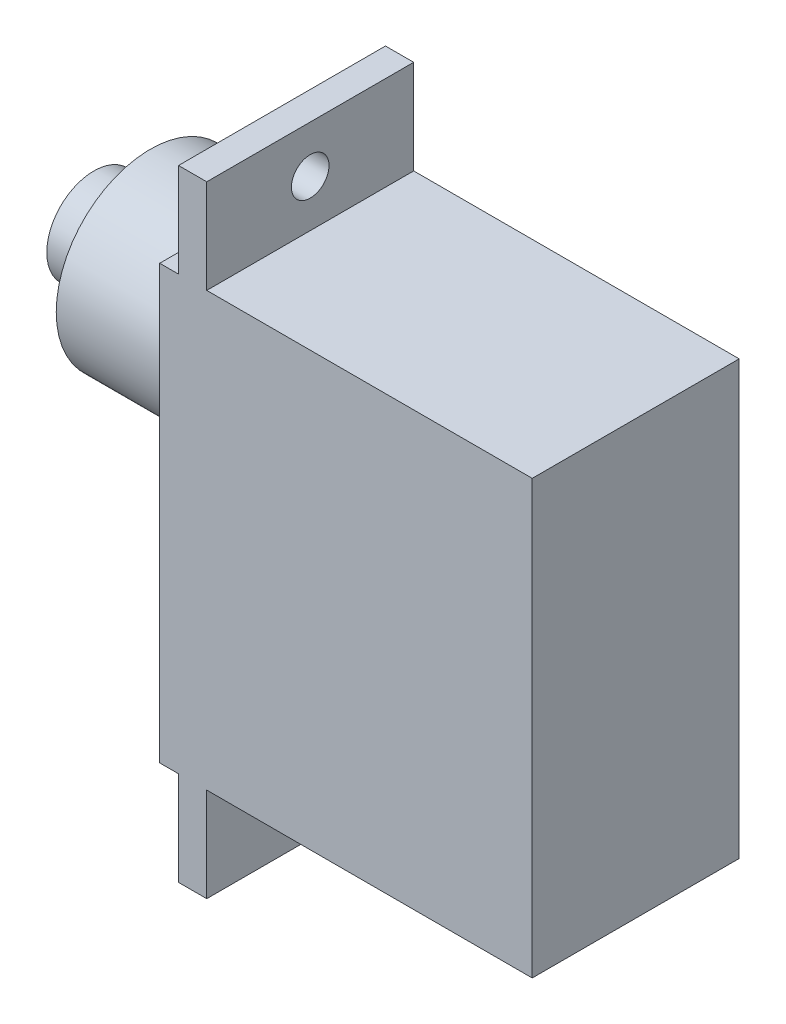
ISO-10303-21;
HEADER;
FILE_DESCRIPTION(('STEP AP214'),'2;1');
FILE_NAME('part.step','',(''),(''),'','','');
FILE_SCHEMA(('AUTOMOTIVE_DESIGN { 1 0 10303 214 1 1 1 1 }'));
ENDSEC;
DATA;
#1=APPLICATION_CONTEXT('core data for automotive mechanical design processes');
#2=APPLICATION_PROTOCOL_DEFINITION('international standard','automotive_design',2000,#1);
#3=PRODUCT_CONTEXT('',#1,'mechanical');
#4=PRODUCT('Part','Part','',(#3));
#5=PRODUCT_RELATED_PRODUCT_CATEGORY('part','',(#4));
#6=PRODUCT_DEFINITION_FORMATION('','',#4);
#7=PRODUCT_DEFINITION_CONTEXT('part definition',#1,'design');
#8=PRODUCT_DEFINITION('design','',#6,#7);
#9=PRODUCT_DEFINITION_SHAPE('','',#8);
#10=(LENGTH_UNIT() NAMED_UNIT(*) SI_UNIT(.MILLI.,.METRE.));
#11=(NAMED_UNIT(*) PLANE_ANGLE_UNIT() SI_UNIT($,.RADIAN.));
#12=(NAMED_UNIT(*) SI_UNIT($,.STERADIAN.) SOLID_ANGLE_UNIT());
#13=UNCERTAINTY_MEASURE_WITH_UNIT(LENGTH_MEASURE(1.E-05),#10,'distance_accuracy_value','');
#14=(GEOMETRIC_REPRESENTATION_CONTEXT(3) GLOBAL_UNCERTAINTY_ASSIGNED_CONTEXT((#13)) GLOBAL_UNIT_ASSIGNED_CONTEXT((#10,
#11,#12)) REPRESENTATION_CONTEXT('',''));
#15=CARTESIAN_POINT('',(0.,0.,0.));
#16=DIRECTION('',(0.,0.,1.));
#17=DIRECTION('',(1.,0.,0.));
#18=AXIS2_PLACEMENT_3D('',#15,#16,#17);
#19=CARTESIAN_POINT('',(81.9999999999995,664.832012286229,-420.357743681072));
#20=DIRECTION('',(-1.,0.,0.));
#21=DIRECTION('',(0.,0.,1.));
#22=AXIS2_PLACEMENT_3D('',#19,#20,#21);
#23=PLANE('',#22);
#24=CARTESIAN_POINT('',(81.9999999999995,667.332012286229,-417.857743681072));
#25=DIRECTION('',(-1.,0.,0.));
#26=DIRECTION('',(0.,0.,1.));
#27=AXIS2_PLACEMENT_3D('',#24,#25,#26);
#28=CIRCLE('',#27,2.50000000000016);
#29=CARTESIAN_POINT('',(81.9999999999995,667.332012286229,-415.357743681072));
#30=VERTEX_POINT('',#29);
#31=EDGE_CURVE('E20',#30,#30,#28,.F.);
#32=ORIENTED_EDGE('',*,*,#31,.F.);
#33=EDGE_LOOP('',(#32));
#34=FACE_BOUND('',#33,.T.);
#35=ADVANCED_FACE('F17',(#34),#23,.T.);
#36=CARTESIAN_POINT('',(84.9999999999996,667.332012286229,-417.857743681072));
#37=DIRECTION('',(-1.,0.,0.));
#38=DIRECTION('',(0.,0.,1.));
#39=AXIS2_PLACEMENT_3D('',#36,#37,#38);
#40=CYLINDRICAL_SURFACE('',#39,2.50000000000016);
#41=CARTESIAN_POINT('',(84.9999999999995,667.332012286229,-417.857743681072));
#42=DIRECTION('',(-1.,0.,0.));
#43=DIRECTION('',(0.,0.,1.));
#44=AXIS2_PLACEMENT_3D('',#41,#42,#43);
#45=CIRCLE('',#44,2.50000000000016);
#46=CARTESIAN_POINT('',(84.9999999999995,667.332012286229,-415.357743681072));
#47=VERTEX_POINT('',#46);
#48=EDGE_CURVE('E147',#47,#47,#45,.T.);
#49=ORIENTED_EDGE('',*,*,#48,.T.);
#50=EDGE_LOOP('',(#49));
#51=FACE_BOUND('',#50,.T.);
#52=ORIENTED_EDGE('',*,*,#31,.T.);
#53=EDGE_LOOP('',(#52));
#54=FACE_BOUND('',#53,.T.);
#55=ADVANCED_FACE('F179',(#51,#54),#40,.T.);
#56=CARTESIAN_POINT('',(84.9999999999995,662.332012286226,-412.857743681076));
#57=DIRECTION('',(1.,0.,0.));
#58=DIRECTION('',(0.,1.,0.));
#59=AXIS2_PLACEMENT_3D('',#56,#57,#58);
#60=PLANE('',#59);
#61=ORIENTED_EDGE('',*,*,#48,.F.);
#62=EDGE_LOOP('',(#61));
#63=FACE_BOUND('',#62,.T.);
#64=CARTESIAN_POINT('',(84.9999999999995,667.332012286226,-417.857743681077));
#65=DIRECTION('',(-1.,0.,-2.85882428840981E-13));
#66=DIRECTION('',(-2.85882428840981E-13,0.,1.));
#67=AXIS2_PLACEMENT_3D('',#64,#65,#66);
#68=CIRCLE('',#67,5.00000000000007);
#69=CARTESIAN_POINT('',(84.9999999999981,667.332012286226,-412.857743681077));
#70=VERTEX_POINT('',#69);
#71=EDGE_CURVE('E142',#70,#70,#68,.F.);
#72=ORIENTED_EDGE('',*,*,#71,.F.);
#73=EDGE_LOOP('',(#72));
#74=FACE_BOUND('',#73,.T.);
#75=ADVANCED_FACE('F186',(#63,#74),#60,.F.);
#76=CARTESIAN_POINT('',(93.5000000000045,644.832012286232,-423.357743681072));
#77=DIRECTION('',(0.,-1.,0.));
#78=DIRECTION('',(0.,0.,-1.));
#79=AXIS2_PLACEMENT_3D('',#76,#77,#78);
#80=PLANE('',#79);
#81=DIRECTION('',(2.90171926890664E-13,0.,-1.));
#82=VECTOR('',#81,1.);
#83=CARTESIAN_POINT('',(91.999999999998,644.832012286232,-412.357743681072));
#84=LINE('',#83,#82);
#85=CARTESIAN_POINT('',(91.9999999999985,644.832012286232,-412.357743681076));
#86=VERTEX_POINT('',#85);
#87=CARTESIAN_POINT('',(92.0000000000007,644.832012286232,-423.357743681079));
#88=VERTEX_POINT('',#87);
#89=EDGE_CURVE('E166',#86,#88,#84,.T.);
#90=ORIENTED_EDGE('',*,*,#89,.T.);
#91=DIRECTION('',(1.,0.,2.9157372363894E-13));
#92=VECTOR('',#91,1.);
#93=CARTESIAN_POINT('',(110.800000000002,644.832012286232,-423.357743681081));
#94=LINE('',#93,#92);
#95=CARTESIAN_POINT('',(93.5000000000014,644.832012286232,-423.357743681079));
#96=VERTEX_POINT('',#95);
#97=EDGE_CURVE('E134',#88,#96,#94,.T.);
#98=ORIENTED_EDGE('',*,*,#97,.T.);
#99=DIRECTION('',(-2.90171926890666E-13,0.,1.));
#100=VECTOR('',#99,1.);
#101=CARTESIAN_POINT('',(93.499999999998,644.832012286232,-412.357743681072));
#102=LINE('',#101,#100);
#103=CARTESIAN_POINT('',(93.4999999999999,644.832012286232,-412.357743681076));
#104=VERTEX_POINT('',#103);
#105=EDGE_CURVE('E171',#96,#104,#102,.T.);
#106=ORIENTED_EDGE('',*,*,#105,.T.);
#107=DIRECTION('',(1.,0.,0.));
#108=VECTOR('',#107,1.);
#109=CARTESIAN_POINT('',(93.5000000000045,644.832012286232,-412.357743681072));
#110=LINE('',#109,#108);
#111=EDGE_CURVE('E145',#104,#86,#110,.F.);
#112=ORIENTED_EDGE('',*,*,#111,.T.);
#113=EDGE_LOOP('',(#90,#98,#106,#112));
#114=FACE_BOUND('',#113,.T.);
#115=ADVANCED_FACE('F247',(#114),#80,.T.);
#116=CARTESIAN_POINT('',(91.1652646737944,647.332012286229,-417.857743681072));
#117=DIRECTION('',(1.,0.,0.));
#118=DIRECTION('',(0.,0.,-1.));
#119=AXIS2_PLACEMENT_3D('',#116,#117,#118);
#120=CYLINDRICAL_SURFACE('',#119,1.);
#121=CARTESIAN_POINT('',(91.9999999999995,647.332012286229,-417.857743681072));
#122=DIRECTION('',(1.,0.,0.));
#123=DIRECTION('',(0.,0.,-1.));
#124=AXIS2_PLACEMENT_3D('',#121,#122,#123);
#125=CIRCLE('',#124,1.);
#126=CARTESIAN_POINT('',(91.9999999999995,647.332012286229,-418.857743681072));
#127=VERTEX_POINT('',#126);
#128=EDGE_CURVE('E162',#127,#127,#125,.F.);
#129=ORIENTED_EDGE('',*,*,#128,.T.);
#130=EDGE_LOOP('',(#129));
#131=FACE_BOUND('',#130,.T.);
#132=CARTESIAN_POINT('',(93.4999999999995,647.332012286229,-417.857743681072));
#133=DIRECTION('',(1.,0.,0.));
#134=DIRECTION('',(0.,0.,-1.));
#135=AXIS2_PLACEMENT_3D('',#132,#133,#134);
#136=CIRCLE('',#135,1.);
#137=CARTESIAN_POINT('',(93.4999999999995,647.332012286229,-418.857743681072));
#138=VERTEX_POINT('',#137);
#139=EDGE_CURVE('E167',#138,#138,#136,.T.);
#140=ORIENTED_EDGE('',*,*,#139,.T.);
#141=EDGE_LOOP('',(#140));
#142=FACE_BOUND('',#141,.T.);
#143=ADVANCED_FACE('F243',(#131,#142),#120,.F.);
#144=CARTESIAN_POINT('',(92.0000000000014,649.832012286225,-412.357743681072));
#145=DIRECTION('',(0.,1.,0.));
#146=DIRECTION('',(0.,0.,1.));
#147=AXIS2_PLACEMENT_3D('',#144,#145,#146);
#148=PLANE('',#147);
#149=DIRECTION('',(1.,0.,0.));
#150=VECTOR('',#149,1.);
#151=CARTESIAN_POINT('',(92.0000000000014,649.832012286225,-412.357743681087));
#152=LINE('',#151,#150);
#153=CARTESIAN_POINT('',(91.0000000000005,649.832012286227,-412.357743681087));
#154=VERTEX_POINT('',#153);
#155=CARTESIAN_POINT('',(91.9999999999985,649.832012286229,-412.357743681083));
#156=VERTEX_POINT('',#155);
#157=EDGE_CURVE('E143',#154,#156,#152,.T.);
#158=ORIENTED_EDGE('',*,*,#157,.F.);
#159=DIRECTION('',(2.91433543964103E-13,0.,-1.));
#160=VECTOR('',#159,1.);
#161=CARTESIAN_POINT('',(91.0000000000021,649.832012286225,-423.357743681086));
#162=LINE('',#161,#160);
#163=CARTESIAN_POINT('',(91.0000000000022,649.832012286225,-423.357743681079));
#164=VERTEX_POINT('',#163);
#165=EDGE_CURVE('E165',#154,#164,#162,.T.);
#166=ORIENTED_EDGE('',*,*,#165,.T.);
#167=DIRECTION('',(1.,0.,2.9157372363894E-13));
#168=VECTOR('',#167,1.);
#169=CARTESIAN_POINT('',(110.800000000002,649.832012286225,-423.357743681081));
#170=LINE('',#169,#168);
#171=CARTESIAN_POINT('',(92.0000000000007,649.832012286227,-423.357743681079));
#172=VERTEX_POINT('',#171);
#173=EDGE_CURVE('E136',#164,#172,#170,.T.);
#174=ORIENTED_EDGE('',*,*,#173,.T.);
#175=DIRECTION('',(2.90171926890664E-13,0.,-1.));
#176=VECTOR('',#175,1.);
#177=CARTESIAN_POINT('',(91.999999999998,649.832012286232,-412.357743681072));
#178=LINE('',#177,#176);
#179=EDGE_CURVE('E388',#172,#156,#178,.F.);
#180=ORIENTED_EDGE('',*,*,#179,.T.);
#181=EDGE_LOOP('',(#158,#166,#174,#180));
#182=FACE_BOUND('',#181,.T.);
#183=ADVANCED_FACE('F239',(#182),#148,.F.);
#184=CARTESIAN_POINT('',(91.0000000000019,667.332012286226,-417.857743681075));
#185=DIRECTION('',(-1.,0.,-2.85882428840981E-13));
#186=DIRECTION('',(-2.85882428840981E-13,0.,1.));
#187=AXIS2_PLACEMENT_3D('',#184,#185,#186);
#188=CYLINDRICAL_SURFACE('',#187,5.00000000000007);
#189=CARTESIAN_POINT('',(91.0000000000005,667.332012286226,-417.857743681075));
#190=DIRECTION('',(-1.,0.,-2.85882428840981E-13));
#191=DIRECTION('',(-2.85882428840981E-13,0.,1.));
#192=AXIS2_PLACEMENT_3D('',#189,#190,#191);
#193=CIRCLE('',#192,5.00000000000007);
#194=CARTESIAN_POINT('',(90.999999999999,667.332012286226,-412.857743681075));
#195=VERTEX_POINT('',#194);
#196=EDGE_CURVE('E157',#195,#195,#193,.T.);
#197=ORIENTED_EDGE('',*,*,#196,.T.);
#198=EDGE_LOOP('',(#197));
#199=FACE_BOUND('',#198,.T.);
#200=ORIENTED_EDGE('',*,*,#71,.T.);
#201=EDGE_LOOP('',(#200));
#202=FACE_BOUND('',#201,.T.);
#203=ADVANCED_FACE('F235',(#199,#202),#188,.T.);
#204=CARTESIAN_POINT('',(92.0000000000014,672.832012286225,-412.357743681072));
#205=DIRECTION('',(0.,1.,0.));
#206=DIRECTION('',(0.,0.,1.));
#207=AXIS2_PLACEMENT_3D('',#204,#205,#206);
#208=PLANE('',#207);
#209=DIRECTION('',(2.91433543964103E-13,0.,-1.));
#210=VECTOR('',#209,1.);
#211=CARTESIAN_POINT('',(91.0000000000021,672.832012286225,-423.357743681086));
#212=LINE('',#211,#210);
#213=CARTESIAN_POINT('',(91.0000000000022,672.832012286225,-423.357743681083));
#214=VERTEX_POINT('',#213);
#215=CARTESIAN_POINT('',(91.0000000000005,672.832012286225,-412.357743681087));
#216=VERTEX_POINT('',#215);
#217=EDGE_CURVE('E161',#214,#216,#212,.F.);
#218=ORIENTED_EDGE('',*,*,#217,.T.);
#219=DIRECTION('',(1.,0.,0.));
#220=VECTOR('',#219,1.);
#221=CARTESIAN_POINT('',(92.0000000000014,672.832012286225,-412.357743681087));
#222=LINE('',#221,#220);
#223=CARTESIAN_POINT('',(91.9999999999984,672.832012286225,-412.357743681083));
#224=VERTEX_POINT('',#223);
#225=EDGE_CURVE('E140',#216,#224,#222,.T.);
#226=ORIENTED_EDGE('',*,*,#225,.T.);
#227=DIRECTION('',(2.90618E-13,0.,-1.));
#228=VECTOR('',#227,1.);
#229=CARTESIAN_POINT('',(91.9999999999995,672.832012286225,-417.857743681072));
#230=LINE('',#229,#228);
#231=CARTESIAN_POINT('',(91.9999999999999,672.832012286225,-423.357743681076));
#232=VERTEX_POINT('',#231);
#233=EDGE_CURVE('E160',#224,#232,#230,.T.);
#234=ORIENTED_EDGE('',*,*,#233,.T.);
#235=DIRECTION('',(1.,0.,2.9157372363894E-13));
#236=VECTOR('',#235,1.);
#237=CARTESIAN_POINT('',(110.800000000002,672.832012286225,-423.357743681081));
#238=LINE('',#237,#236);
#239=EDGE_CURVE('E116',#232,#214,#238,.F.);
#240=ORIENTED_EDGE('',*,*,#239,.T.);
#241=EDGE_LOOP('',(#218,#226,#234,#240));
#242=FACE_BOUND('',#241,.T.);
#243=ADVANCED_FACE('F231',(#242),#208,.T.);
#244=CARTESIAN_POINT('',(92.7499999999995,677.832012286225,-417.857743681072));
#245=DIRECTION('',(0.,1.,0.));
#246=DIRECTION('',(0.,0.,1.));
#247=AXIS2_PLACEMENT_3D('',#244,#245,#246);
#248=PLANE('',#247);
#249=DIRECTION('',(2.90618E-13,0.,-1.));
#250=VECTOR('',#249,1.);
#251=CARTESIAN_POINT('',(91.9999999999995,677.832012286225,-417.857743681072));
#252=LINE('',#251,#250);
#253=CARTESIAN_POINT('',(92.0000000000013,677.832012286225,-423.357743681079));
#254=VERTEX_POINT('',#253);
#255=CARTESIAN_POINT('',(91.9999999999998,677.832012286225,-412.357743681076));
#256=VERTEX_POINT('',#255);
#257=EDGE_CURVE('E156',#254,#256,#252,.F.);
#258=ORIENTED_EDGE('',*,*,#257,.T.);
#259=DIRECTION('',(1.,0.,0.));
#260=VECTOR('',#259,1.);
#261=CARTESIAN_POINT('',(92.7499999999995,677.832012286225,-412.357743681072));
#262=LINE('',#261,#260);
#263=CARTESIAN_POINT('',(93.4999999999984,677.832012286225,-412.357743681076));
#264=VERTEX_POINT('',#263);
#265=EDGE_CURVE('E138',#256,#264,#262,.T.);
#266=ORIENTED_EDGE('',*,*,#265,.T.);
#267=DIRECTION('',(-2.90618E-13,0.,1.));
#268=VECTOR('',#267,1.);
#269=CARTESIAN_POINT('',(93.4999999999995,677.832012286225,-417.857743681072));
#270=LINE('',#269,#268);
#271=CARTESIAN_POINT('',(93.5000000000006,677.832012286225,-423.357743681079));
#272=VERTEX_POINT('',#271);
#273=EDGE_CURVE('E151',#264,#272,#270,.F.);
#274=ORIENTED_EDGE('',*,*,#273,.T.);
#275=DIRECTION('',(1.,0.,2.9157372363894E-13));
#276=VECTOR('',#275,1.);
#277=CARTESIAN_POINT('',(110.800000000002,677.832012286225,-423.357743681081));
#278=LINE('',#277,#276);
#279=EDGE_CURVE('E132',#272,#254,#278,.F.);
#280=ORIENTED_EDGE('',*,*,#279,.T.);
#281=EDGE_LOOP('',(#258,#266,#274,#280));
#282=FACE_BOUND('',#281,.T.);
#283=ADVANCED_FACE('F227',(#282),#248,.T.);
#284=CARTESIAN_POINT('',(91.9999999999993,675.332012286229,-417.857743681072));
#285=DIRECTION('',(1.,0.,0.));
#286=DIRECTION('',(0.,0.,-1.));
#287=AXIS2_PLACEMENT_3D('',#284,#285,#286);
#288=CYLINDRICAL_SURFACE('',#287,1.00000000000001);
#289=CARTESIAN_POINT('',(91.9999999999995,675.332012286229,-417.857743681072));
#290=DIRECTION('',(1.,0.,0.));
#291=DIRECTION('',(0.,0.,-1.));
#292=AXIS2_PLACEMENT_3D('',#289,#290,#291);
#293=CIRCLE('',#292,1.00000000000001);
#294=CARTESIAN_POINT('',(91.9999999999994,675.332012286229,-418.857743681072));
#295=VERTEX_POINT('',#294);
#296=EDGE_CURVE('E152',#295,#295,#293,.F.);
#297=ORIENTED_EDGE('',*,*,#296,.T.);
#298=EDGE_LOOP('',(#297));
#299=FACE_BOUND('',#298,.T.);
#300=CARTESIAN_POINT('',(93.4999999999995,675.332012286229,-417.857743681072));
#301=DIRECTION('',(1.,0.,0.));
#302=DIRECTION('',(0.,0.,-1.));
#303=AXIS2_PLACEMENT_3D('',#300,#301,#302);
#304=CIRCLE('',#303,1.00000000000001);
#305=CARTESIAN_POINT('',(93.4999999999995,675.332012286229,-418.857743681072));
#306=VERTEX_POINT('',#305);
#307=EDGE_CURVE('E148',#306,#306,#304,.T.);
#308=ORIENTED_EDGE('',*,*,#307,.T.);
#309=EDGE_LOOP('',(#308));
#310=FACE_BOUND('',#309,.T.);
#311=ADVANCED_FACE('F224',(#299,#310),#288,.F.);
#312=CARTESIAN_POINT('',(110.800000000002,644.832012286232,-423.357743681081));
#313=DIRECTION('',(-2.9157372363894E-13,0.,1.));
#314=DIRECTION('',(1.,0.,2.9157372363894E-13));
#315=AXIS2_PLACEMENT_3D('',#312,#313,#314);
#316=PLANE('',#315);
#317=DIRECTION('',(0.,1.,0.));
#318=VECTOR('',#317,1.);
#319=CARTESIAN_POINT('',(92.0000000000011,675.332012286225,-423.357743681072));
#320=LINE('',#319,#318);
#321=EDGE_CURVE('E421',#232,#254,#320,.T.);
#322=ORIENTED_EDGE('',*,*,#321,.T.);
#323=ORIENTED_EDGE('',*,*,#279,.F.);
#324=DIRECTION('',(0.,1.,0.));
#325=VECTOR('',#324,1.);
#326=CARTESIAN_POINT('',(93.5000000000011,675.332012286225,-423.357743681072));
#327=LINE('',#326,#325);
#328=CARTESIAN_POINT('',(93.5000000000013,672.832012286225,-423.357743681078));
#329=VERTEX_POINT('',#328);
#330=EDGE_CURVE('E155',#272,#329,#327,.F.);
#331=ORIENTED_EDGE('',*,*,#330,.T.);
#332=DIRECTION('',(1.,0.,0.));
#333=VECTOR('',#332,1.);
#334=CARTESIAN_POINT('',(110.800000000002,672.832012286225,-423.357743681081));
#335=LINE('',#334,#333);
#336=CARTESIAN_POINT('',(110.800000000001,672.832012286225,-423.357743681081));
#337=VERTEX_POINT('',#336);
#338=EDGE_CURVE('E110',#337,#329,#335,.F.);
#339=ORIENTED_EDGE('',*,*,#338,.F.);
#340=DIRECTION('',(0.,1.,0.));
#341=VECTOR('',#340,1.);
#342=CARTESIAN_POINT('',(110.800000000002,672.832012286225,-423.357743681081));
#343=LINE('',#342,#341);
#344=CARTESIAN_POINT('',(110.800000000001,649.832012286227,-423.357743681081));
#345=VERTEX_POINT('',#344);
#346=EDGE_CURVE('E107',#337,#345,#343,.F.);
#347=ORIENTED_EDGE('',*,*,#346,.T.);
#348=DIRECTION('',(1.,0.,0.));
#349=VECTOR('',#348,1.);
#350=CARTESIAN_POINT('',(110.800000000002,649.832012286225,-423.357743681081));
#351=LINE('',#350,#349);
#352=CARTESIAN_POINT('',(93.5000000000014,649.832012286229,-423.35774368108));
#353=VERTEX_POINT('',#352);
#354=EDGE_CURVE('E104',#345,#353,#351,.F.);
#355=ORIENTED_EDGE('',*,*,#354,.T.);
#356=DIRECTION('',(0.,1.,0.));
#357=VECTOR('',#356,1.);
#358=CARTESIAN_POINT('',(93.5000000000012,644.832012286232,-423.357743681072));
#359=LINE('',#358,#357);
#360=EDGE_CURVE('E398',#353,#96,#359,.F.);
#361=ORIENTED_EDGE('',*,*,#360,.T.);
#362=ORIENTED_EDGE('',*,*,#97,.F.);
#363=DIRECTION('',(0.,1.,0.));
#364=VECTOR('',#363,1.);
#365=CARTESIAN_POINT('',(92.0000000000012,649.832012286232,-423.357743681072));
#366=LINE('',#365,#364);
#367=EDGE_CURVE('E170',#88,#172,#366,.T.);
#368=ORIENTED_EDGE('',*,*,#367,.T.);
#369=ORIENTED_EDGE('',*,*,#173,.F.);
#370=DIRECTION('',(0.,1.,0.));
#371=VECTOR('',#370,1.);
#372=CARTESIAN_POINT('',(91.0000000000021,649.832012286225,-423.357743681086));
#373=LINE('',#372,#371);
#374=EDGE_CURVE('E426',#164,#214,#373,.T.);
#375=ORIENTED_EDGE('',*,*,#374,.T.);
#376=ORIENTED_EDGE('',*,*,#239,.F.);
#377=EDGE_LOOP('',(#322,#323,#331,#339,#347,#355,#361,#362,#368,#369,#375,#376));
#378=FACE_BOUND('',#377,.T.);
#379=ADVANCED_FACE('F109',(#378),#316,.F.);
#380=CARTESIAN_POINT('',(110.800000000002,672.832012286225,-423.357743681081));
#381=DIRECTION('',(-1.,0.,-2.90171926890666E-13));
#382=DIRECTION('',(-2.90171926890666E-13,0.,1.));
#383=AXIS2_PLACEMENT_3D('',#380,#381,#382);
#384=PLANE('',#383);
#385=DIRECTION('',(0.,0.,1.));
#386=VECTOR('',#385,1.);
#387=CARTESIAN_POINT('',(110.799999999999,672.832012286225,-412.357743681067));
#388=LINE('',#387,#386);
#389=CARTESIAN_POINT('',(110.799999999999,672.832012286225,-412.357743681079));
#390=VERTEX_POINT('',#389);
#391=EDGE_CURVE('E413',#390,#337,#388,.F.);
#392=ORIENTED_EDGE('',*,*,#391,.F.);
#393=DIRECTION('',(0.,1.,0.));
#394=VECTOR('',#393,1.);
#395=CARTESIAN_POINT('',(110.799999999999,677.832012286225,-412.357743681081));
#396=LINE('',#395,#394);
#397=CARTESIAN_POINT('',(110.799999999999,649.832012286225,-412.357743681079));
#398=VERTEX_POINT('',#397);
#399=EDGE_CURVE('E127',#390,#398,#396,.F.);
#400=ORIENTED_EDGE('',*,*,#399,.T.);
#401=DIRECTION('',(0.,0.,1.));
#402=VECTOR('',#401,1.);
#403=CARTESIAN_POINT('',(110.799999999999,649.832012286225,-412.357743681067));
#404=LINE('',#403,#402);
#405=EDGE_CURVE('E115',#398,#345,#404,.F.);
#406=ORIENTED_EDGE('',*,*,#405,.T.);
#407=ORIENTED_EDGE('',*,*,#346,.F.);
#408=EDGE_LOOP('',(#392,#400,#406,#407));
#409=FACE_BOUND('',#408,.T.);
#410=ADVANCED_FACE('F126',(#409),#384,.F.);
#411=CARTESIAN_POINT('',(110.800000000002,649.832012286225,-412.357743681067));
#412=DIRECTION('',(0.,1.,0.));
#413=DIRECTION('',(0.,0.,1.));
#414=AXIS2_PLACEMENT_3D('',#411,#412,#413);
#415=PLANE('',#414);
#416=ORIENTED_EDGE('',*,*,#354,.F.);
#417=ORIENTED_EDGE('',*,*,#405,.F.);
#418=DIRECTION('',(-1.,0.,-2.91573723638927E-13));
#419=VECTOR('',#418,1.);
#420=CARTESIAN_POINT('',(110.799999999999,649.832012286225,-412.357743681081));
#421=LINE('',#420,#419);
#422=CARTESIAN_POINT('',(93.4999999999999,649.832012286227,-412.357743681076));
#423=VERTEX_POINT('',#422);
#424=EDGE_CURVE('E404',#398,#423,#421,.T.);
#425=ORIENTED_EDGE('',*,*,#424,.T.);
#426=DIRECTION('',(-2.90171926890666E-13,0.,1.));
#427=VECTOR('',#426,1.);
#428=CARTESIAN_POINT('',(93.499999999998,649.832012286232,-412.357743681072));
#429=LINE('',#428,#427);
#430=EDGE_CURVE('E123',#423,#353,#429,.F.);
#431=ORIENTED_EDGE('',*,*,#430,.T.);
#432=EDGE_LOOP('',(#416,#417,#425,#431));
#433=FACE_BOUND('',#432,.T.);
#434=ADVANCED_FACE('F120',(#433),#415,.F.);
#435=CARTESIAN_POINT('',(93.499999999998,644.832012286232,-412.357743681072));
#436=DIRECTION('',(-1.,0.,-2.90171926890666E-13));
#437=DIRECTION('',(-2.90171926890666E-13,0.,1.));
#438=AXIS2_PLACEMENT_3D('',#435,#436,#437);
#439=PLANE('',#438);
#440=ORIENTED_EDGE('',*,*,#139,.F.);
#441=EDGE_LOOP('',(#440));
#442=FACE_BOUND('',#441,.T.);
#443=ORIENTED_EDGE('',*,*,#360,.F.);
#444=ORIENTED_EDGE('',*,*,#430,.F.);
#445=DIRECTION('',(0.,1.,0.));
#446=VECTOR('',#445,1.);
#447=CARTESIAN_POINT('',(93.4999999999986,677.832012286225,-412.357743681086));
#448=LINE('',#447,#446);
#449=EDGE_CURVE('E402',#423,#104,#448,.F.);
#450=ORIENTED_EDGE('',*,*,#449,.T.);
#451=ORIENTED_EDGE('',*,*,#105,.F.);
#452=EDGE_LOOP('',(#443,#444,#450,#451));
#453=FACE_BOUND('',#452,.T.);
#454=ADVANCED_FACE('F213',(#442,#453),#439,.F.);
#455=CARTESIAN_POINT('',(91.999999999998,649.832012286232,-412.357743681072));
#456=DIRECTION('',(1.,0.,2.90171926890664E-13));
#457=DIRECTION('',(2.90171926890664E-13,0.,-1.));
#458=AXIS2_PLACEMENT_3D('',#455,#456,#457);
#459=PLANE('',#458);
#460=ORIENTED_EDGE('',*,*,#128,.F.);
#461=EDGE_LOOP('',(#460));
#462=FACE_BOUND('',#461,.T.);
#463=DIRECTION('',(0.,1.,0.));
#464=VECTOR('',#463,1.);
#465=CARTESIAN_POINT('',(91.9999999999986,677.832012286225,-412.357743681087));
#466=LINE('',#465,#464);
#467=EDGE_CURVE('E403',#86,#156,#466,.T.);
#468=ORIENTED_EDGE('',*,*,#467,.T.);
#469=ORIENTED_EDGE('',*,*,#179,.F.);
#470=ORIENTED_EDGE('',*,*,#367,.F.);
#471=ORIENTED_EDGE('',*,*,#89,.F.);
#472=EDGE_LOOP('',(#468,#469,#470,#471));
#473=FACE_BOUND('',#472,.T.);
#474=ADVANCED_FACE('F209',(#462,#473),#459,.F.);
#475=CARTESIAN_POINT('',(91.0000000000021,649.832012286225,-423.357743681086));
#476=DIRECTION('',(1.,0.,2.91433543964103E-13));
#477=DIRECTION('',(2.91433543964103E-13,0.,-1.));
#478=AXIS2_PLACEMENT_3D('',#475,#476,#477);
#479=PLANE('',#478);
#480=ORIENTED_EDGE('',*,*,#196,.F.);
#481=EDGE_LOOP('',(#480));
#482=FACE_BOUND('',#481,.T.);
#483=ORIENTED_EDGE('',*,*,#217,.F.);
#484=ORIENTED_EDGE('',*,*,#374,.F.);
#485=ORIENTED_EDGE('',*,*,#165,.F.);
#486=DIRECTION('',(0.,1.,0.));
#487=VECTOR('',#486,1.);
#488=CARTESIAN_POINT('',(90.9999999999986,677.832012286225,-412.357743681087));
#489=LINE('',#488,#487);
#490=EDGE_CURVE('E406',#154,#216,#489,.T.);
#491=ORIENTED_EDGE('',*,*,#490,.T.);
#492=EDGE_LOOP('',(#483,#484,#485,#491));
#493=FACE_BOUND('',#492,.T.);
#494=ADVANCED_FACE('F205',(#482,#493),#479,.F.);
#495=CARTESIAN_POINT('',(91.9999999999995,675.332012286225,-417.857743681072));
#496=DIRECTION('',(1.,0.,2.90618E-13));
#497=DIRECTION('',(2.90618E-13,0.,-1.));
#498=AXIS2_PLACEMENT_3D('',#495,#496,#497);
#499=PLANE('',#498);
#500=ORIENTED_EDGE('',*,*,#296,.F.);
#501=EDGE_LOOP('',(#500));
#502=FACE_BOUND('',#501,.T.);
#503=ORIENTED_EDGE('',*,*,#321,.F.);
#504=ORIENTED_EDGE('',*,*,#233,.F.);
#505=DIRECTION('',(0.,1.,0.));
#506=VECTOR('',#505,1.);
#507=CARTESIAN_POINT('',(91.9999999999986,677.832012286225,-412.357743681087));
#508=LINE('',#507,#506);
#509=EDGE_CURVE('E437',#224,#256,#508,.T.);
#510=ORIENTED_EDGE('',*,*,#509,.T.);
#511=ORIENTED_EDGE('',*,*,#257,.F.);
#512=EDGE_LOOP('',(#503,#504,#510,#511));
#513=FACE_BOUND('',#512,.T.);
#514=ADVANCED_FACE('F201',(#502,#513),#499,.F.);
#515=CARTESIAN_POINT('',(93.4999999999995,675.332012286225,-417.857743681072));
#516=DIRECTION('',(-1.,0.,-2.90618E-13));
#517=DIRECTION('',(-2.90618E-13,0.,1.));
#518=AXIS2_PLACEMENT_3D('',#515,#516,#517);
#519=PLANE('',#518);
#520=ORIENTED_EDGE('',*,*,#307,.F.);
#521=EDGE_LOOP('',(#520));
#522=FACE_BOUND('',#521,.T.);
#523=DIRECTION('',(0.,1.,0.));
#524=VECTOR('',#523,1.);
#525=CARTESIAN_POINT('',(93.4999999999986,677.832012286225,-412.357743681086));
#526=LINE('',#525,#524);
#527=CARTESIAN_POINT('',(93.4999999999989,672.832012286225,-412.357743681076));
#528=VERTEX_POINT('',#527);
#529=EDGE_CURVE('E26',#264,#528,#526,.F.);
#530=ORIENTED_EDGE('',*,*,#529,.T.);
#531=DIRECTION('',(0.,0.,1.));
#532=VECTOR('',#531,1.);
#533=CARTESIAN_POINT('',(93.5000000000014,672.832012286225,-412.357743681067));
#534=LINE('',#533,#532);
#535=EDGE_CURVE('E34',#329,#528,#534,.T.);
#536=ORIENTED_EDGE('',*,*,#535,.F.);
#537=ORIENTED_EDGE('',*,*,#330,.F.);
#538=ORIENTED_EDGE('',*,*,#273,.F.);
#539=EDGE_LOOP('',(#530,#536,#537,#538));
#540=FACE_BOUND('',#539,.T.);
#541=ADVANCED_FACE('F195',(#522,#540),#519,.F.);
#542=CARTESIAN_POINT('',(110.800000000002,672.832012286225,-412.357743681067));
#543=DIRECTION('',(0.,1.,0.));
#544=DIRECTION('',(0.,0.,1.));
#545=AXIS2_PLACEMENT_3D('',#542,#543,#544);
#546=PLANE('',#545);
#547=ORIENTED_EDGE('',*,*,#391,.T.);
#548=ORIENTED_EDGE('',*,*,#338,.T.);
#549=ORIENTED_EDGE('',*,*,#535,.T.);
#550=DIRECTION('',(-1.,0.,-2.91573723638927E-13));
#551=VECTOR('',#550,1.);
#552=CARTESIAN_POINT('',(110.799999999999,672.832012286225,-412.357743681081));
#553=LINE('',#552,#551);
#554=EDGE_CURVE('E11',#528,#390,#553,.F.);
#555=ORIENTED_EDGE('',*,*,#554,.T.);
#556=EDGE_LOOP('',(#547,#548,#549,#555));
#557=FACE_BOUND('',#556,.T.);
#558=ADVANCED_FACE('F189',(#557),#546,.T.);
#559=CARTESIAN_POINT('',(110.799999999999,677.832012286225,-412.357743681081));
#560=DIRECTION('',(2.91573723638927E-13,0.,-1.));
#561=DIRECTION('',(-1.,0.,-2.91573723638927E-13));
#562=AXIS2_PLACEMENT_3D('',#559,#560,#561);
#563=PLANE('',#562);
#564=ORIENTED_EDGE('',*,*,#529,.F.);
#565=ORIENTED_EDGE('',*,*,#265,.F.);
#566=ORIENTED_EDGE('',*,*,#509,.F.);
#567=ORIENTED_EDGE('',*,*,#225,.F.);
#568=ORIENTED_EDGE('',*,*,#490,.F.);
#569=ORIENTED_EDGE('',*,*,#157,.T.);
#570=ORIENTED_EDGE('',*,*,#467,.F.);
#571=ORIENTED_EDGE('',*,*,#111,.F.);
#572=ORIENTED_EDGE('',*,*,#449,.F.);
#573=ORIENTED_EDGE('',*,*,#424,.F.);
#574=ORIENTED_EDGE('',*,*,#399,.F.);
#575=ORIENTED_EDGE('',*,*,#554,.F.);
#576=EDGE_LOOP('',(#564,#565,#566,#567,#568,#569,#570,#571,#572,#573,#574,#575));
#577=FACE_BOUND('',#576,.T.);
#578=ADVANCED_FACE('F187',(#577),#563,.F.);
#579=CLOSED_SHELL('',(#35,#55,#75,#115,#143,#183,#203,#243,#283,#311,#379,#410,#434,#454,#474,
#494,#514,#541,#558,#578));
#580=MANIFOLD_SOLID_BREP('B1',#579);
#581=ADVANCED_BREP_SHAPE_REPRESENTATION('',(#18,#580),#14);
#582=SHAPE_DEFINITION_REPRESENTATION(#9,#581);
ENDSEC;
END-ISO-10303-21;
